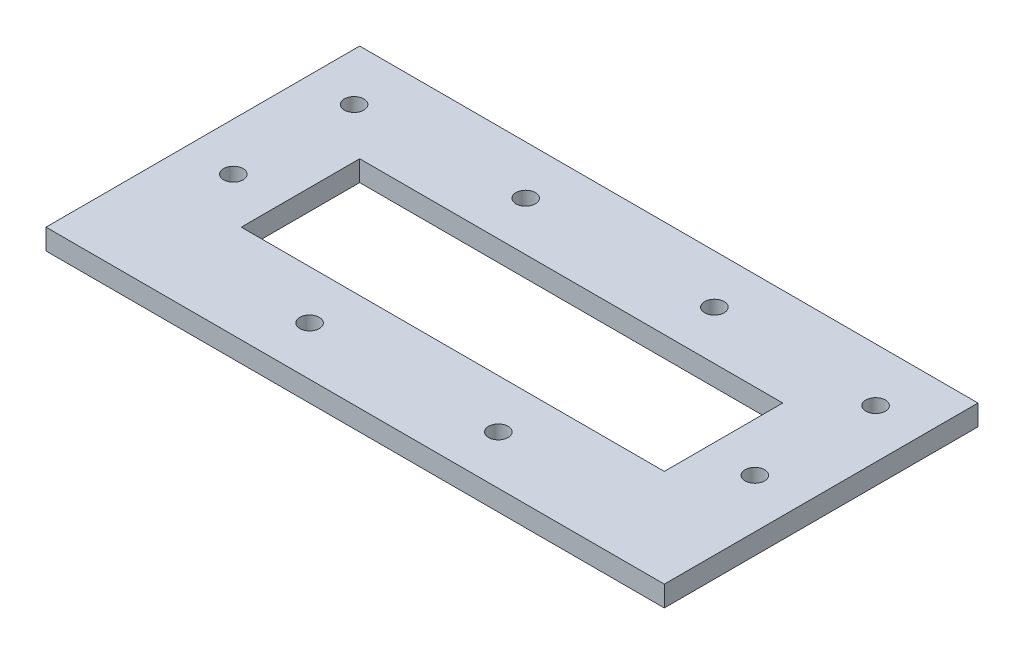
ISO-10303-21;
HEADER;
FILE_DESCRIPTION(('STEP AP214'),'2;1');
FILE_NAME('part.step','',(''),(''),'','','');
FILE_SCHEMA(('AUTOMOTIVE_DESIGN { 1 0 10303 214 1 1 1 1 }'));
ENDSEC;
DATA;
#1=APPLICATION_CONTEXT('core data for automotive mechanical design processes');
#2=APPLICATION_PROTOCOL_DEFINITION('international standard','automotive_design',2000,#1);
#3=PRODUCT_CONTEXT('',#1,'mechanical');
#4=PRODUCT('Part','Part','',(#3));
#5=PRODUCT_RELATED_PRODUCT_CATEGORY('part','',(#4));
#6=PRODUCT_DEFINITION_FORMATION('','',#4);
#7=PRODUCT_DEFINITION_CONTEXT('part definition',#1,'design');
#8=PRODUCT_DEFINITION('design','',#6,#7);
#9=PRODUCT_DEFINITION_SHAPE('','',#8);
#10=(LENGTH_UNIT() NAMED_UNIT(*) SI_UNIT(.MILLI.,.METRE.));
#11=(NAMED_UNIT(*) PLANE_ANGLE_UNIT() SI_UNIT($,.RADIAN.));
#12=(NAMED_UNIT(*) SI_UNIT($,.STERADIAN.) SOLID_ANGLE_UNIT());
#13=UNCERTAINTY_MEASURE_WITH_UNIT(LENGTH_MEASURE(1.E-05),#10,'distance_accuracy_value','');
#14=(GEOMETRIC_REPRESENTATION_CONTEXT(3) GLOBAL_UNCERTAINTY_ASSIGNED_CONTEXT((#13)) GLOBAL_UNIT_ASSIGNED_CONTEXT((#10,
#11,#12)) REPRESENTATION_CONTEXT('',''));
#15=CARTESIAN_POINT('',(0.,0.,0.));
#16=DIRECTION('',(0.,0.,1.));
#17=DIRECTION('',(1.,0.,0.));
#18=AXIS2_PLACEMENT_3D('',#15,#16,#17);
#19=CARTESIAN_POINT('',(0.,3.175,0.));
#20=DIRECTION('',(0.,-1.,0.));
#21=DIRECTION('',(0.,0.,-1.));
#22=AXIS2_PLACEMENT_3D('',#19,#20,#21);
#23=PLANE('',#22);
#24=DIRECTION('',(0.,0.,-1.));
#25=VECTOR('',#24,1.);
#26=CARTESIAN_POINT('',(47.499999996,3.175,24.098680149));
#27=LINE('',#26,#25);
#28=CARTESIAN_POINT('',(47.499999996,3.175,24.098680149));
#29=VERTEX_POINT('',#28);
#30=CARTESIAN_POINT('',(47.499999996,3.175,-24.098680149));
#31=VERTEX_POINT('',#30);
#32=EDGE_CURVE('E139',#29,#31,#27,.T.);
#33=ORIENTED_EDGE('',*,*,#32,.T.);
#34=DIRECTION('',(-1.,0.,0.));
#35=VECTOR('',#34,1.);
#36=CARTESIAN_POINT('',(-47.499999996,3.175,-24.098680149));
#37=LINE('',#36,#35);
#38=CARTESIAN_POINT('',(-47.499999996,3.175,-24.098680149));
#39=VERTEX_POINT('',#38);
#40=EDGE_CURVE('E142',#31,#39,#37,.T.);
#41=ORIENTED_EDGE('',*,*,#40,.T.);
#42=DIRECTION('',(0.,0.,1.));
#43=VECTOR('',#42,1.);
#44=CARTESIAN_POINT('',(-47.499999996,3.175,24.098680149));
#45=LINE('',#44,#43);
#46=CARTESIAN_POINT('',(-47.499999996,3.175,24.098680149));
#47=VERTEX_POINT('',#46);
#48=EDGE_CURVE('E145',#39,#47,#45,.T.);
#49=ORIENTED_EDGE('',*,*,#48,.T.);
#50=DIRECTION('',(1.,0.,0.));
#51=VECTOR('',#50,1.);
#52=CARTESIAN_POINT('',(-47.499999996,3.175,24.098680149));
#53=LINE('',#52,#51);
#54=EDGE_CURVE('E147',#47,#29,#53,.T.);
#55=ORIENTED_EDGE('',*,*,#54,.T.);
#56=EDGE_LOOP('',(#33,#41,#49,#55));
#57=FACE_BOUND('',#56,.T.);
#58=DIRECTION('',(0.,0.,-1.));
#59=VECTOR('',#58,1.);
#60=CARTESIAN_POINT('',(32.499999996,3.175,9.09868014899999));
#61=LINE('',#60,#59);
#62=CARTESIAN_POINT('',(32.499999996,3.175,9.09868014899999));
#63=VERTEX_POINT('',#62);
#64=CARTESIAN_POINT('',(32.499999996,3.175,-9.09868014900001));
#65=VERTEX_POINT('',#64);
#66=EDGE_CURVE('E100',#63,#65,#61,.T.);
#67=ORIENTED_EDGE('',*,*,#66,.F.);
#68=DIRECTION('',(1.,0.,0.));
#69=VECTOR('',#68,1.);
#70=CARTESIAN_POINT('',(-32.499999996,3.175,9.098680149));
#71=LINE('',#70,#69);
#72=CARTESIAN_POINT('',(-32.499999996,3.175,9.098680149));
#73=VERTEX_POINT('',#72);
#74=EDGE_CURVE('E123',#73,#63,#71,.T.);
#75=ORIENTED_EDGE('',*,*,#74,.F.);
#76=DIRECTION('',(0.,0.,1.));
#77=VECTOR('',#76,1.);
#78=CARTESIAN_POINT('',(-32.499999996,3.175,9.098680149));
#79=LINE('',#78,#77);
#80=CARTESIAN_POINT('',(-32.499999996,3.175,-9.09868014900001));
#81=VERTEX_POINT('',#80);
#82=EDGE_CURVE('E121',#81,#73,#79,.T.);
#83=ORIENTED_EDGE('',*,*,#82,.F.);
#84=DIRECTION('',(-1.,0.,0.));
#85=VECTOR('',#84,1.);
#86=CARTESIAN_POINT('',(-32.499999996,3.175,-9.09868014900001));
#87=LINE('',#86,#85);
#88=EDGE_CURVE('E108',#65,#81,#87,.T.);
#89=ORIENTED_EDGE('',*,*,#88,.F.);
#90=EDGE_LOOP('',(#67,#75,#83,#89));
#91=FACE_BOUND('',#90,.T.);
#92=CARTESIAN_POINT('',(-14.499999996,3.175,-16.598680149));
#93=DIRECTION('',(0.,1.,0.));
#94=DIRECTION('',(0.,0.,1.));
#95=AXIS2_PLACEMENT_3D('',#92,#93,#94);
#96=CIRCLE('',#95,1.5);
#97=CARTESIAN_POINT('',(-14.499999996,3.175,-15.098680149));
#98=VERTEX_POINT('',#97);
#99=EDGE_CURVE('E129',#98,#98,#96,.T.);
#100=ORIENTED_EDGE('',*,*,#99,.F.);
#101=EDGE_LOOP('',(#100));
#102=FACE_BOUND('',#101,.T.);
#103=CARTESIAN_POINT('',(14.499999996,3.175,-16.598680149));
#104=DIRECTION('',(0.,1.,0.));
#105=DIRECTION('',(0.,0.,1.));
#106=AXIS2_PLACEMENT_3D('',#103,#104,#105);
#107=CIRCLE('',#106,1.5);
#108=CARTESIAN_POINT('',(14.499999996,3.175,-15.098680149));
#109=VERTEX_POINT('',#108);
#110=EDGE_CURVE('E291',#109,#109,#107,.T.);
#111=ORIENTED_EDGE('',*,*,#110,.F.);
#112=EDGE_LOOP('',(#111));
#113=FACE_BOUND('',#112,.T.);
#114=CARTESIAN_POINT('',(-40.1489742278698,3.175,-15.8817618874375));
#115=DIRECTION('',(0.,1.,0.));
#116=DIRECTION('',(0.,0.,1.));
#117=AXIS2_PLACEMENT_3D('',#114,#115,#116);
#118=CIRCLE('',#117,1.5);
#119=CARTESIAN_POINT('',(-40.1489742278698,3.175,-14.3817618874374));
#120=VERTEX_POINT('',#119);
#121=EDGE_CURVE('E285',#120,#120,#118,.T.);
#122=ORIENTED_EDGE('',*,*,#121,.F.);
#123=EDGE_LOOP('',(#122));
#124=FACE_BOUND('',#123,.T.);
#125=CARTESIAN_POINT('',(-40.1489742278698,3.175,2.662696696534));
#126=DIRECTION('',(0.,1.,0.));
#127=DIRECTION('',(0.,0.,1.));
#128=AXIS2_PLACEMENT_3D('',#125,#126,#127);
#129=CIRCLE('',#128,1.5);
#130=CARTESIAN_POINT('',(-40.1489742278698,3.175,4.162696696534));
#131=VERTEX_POINT('',#130);
#132=EDGE_CURVE('E279',#131,#131,#129,.T.);
#133=ORIENTED_EDGE('',*,*,#132,.F.);
#134=EDGE_LOOP('',(#133));
#135=FACE_BOUND('',#134,.T.);
#136=CARTESIAN_POINT('',(39.9788527335526,3.175,-15.8817618874375));
#137=DIRECTION('',(0.,1.,0.));
#138=DIRECTION('',(0.,0.,1.));
#139=AXIS2_PLACEMENT_3D('',#136,#137,#138);
#140=CIRCLE('',#139,1.5);
#141=CARTESIAN_POINT('',(39.9788527335526,3.175,-14.3817618874374));
#142=VERTEX_POINT('',#141);
#143=EDGE_CURVE('E273',#142,#142,#140,.T.);
#144=ORIENTED_EDGE('',*,*,#143,.F.);
#145=EDGE_LOOP('',(#144));
#146=FACE_BOUND('',#145,.T.);
#147=CARTESIAN_POINT('',(39.9788527335526,3.175,2.662696696534));
#148=DIRECTION('',(0.,1.,0.));
#149=DIRECTION('',(0.,0.,1.));
#150=AXIS2_PLACEMENT_3D('',#147,#148,#149);
#151=CIRCLE('',#150,1.5);
#152=CARTESIAN_POINT('',(39.9788527335526,3.175,4.16269669653401));
#153=VERTEX_POINT('',#152);
#154=EDGE_CURVE('E267',#153,#153,#151,.T.);
#155=ORIENTED_EDGE('',*,*,#154,.F.);
#156=EDGE_LOOP('',(#155));
#157=FACE_BOUND('',#156,.T.);
#158=CARTESIAN_POINT('',(-14.499999996,3.175,16.598680149));
#159=DIRECTION('',(0.,1.,0.));
#160=DIRECTION('',(0.,0.,1.));
#161=AXIS2_PLACEMENT_3D('',#158,#159,#160);
#162=CIRCLE('',#161,1.5);
#163=CARTESIAN_POINT('',(-14.499999996,3.175,18.098680149));
#164=VERTEX_POINT('',#163);
#165=EDGE_CURVE('E261',#164,#164,#162,.T.);
#166=ORIENTED_EDGE('',*,*,#165,.F.);
#167=EDGE_LOOP('',(#166));
#168=FACE_BOUND('',#167,.T.);
#169=CARTESIAN_POINT('',(14.499999996,3.175,16.598680149));
#170=DIRECTION('',(0.,1.,0.));
#171=DIRECTION('',(0.,0.,1.));
#172=AXIS2_PLACEMENT_3D('',#169,#170,#171);
#173=CIRCLE('',#172,1.5);
#174=CARTESIAN_POINT('',(14.499999996,3.175,18.098680149));
#175=VERTEX_POINT('',#174);
#176=EDGE_CURVE('E252',#175,#175,#173,.T.);
#177=ORIENTED_EDGE('',*,*,#176,.F.);
#178=EDGE_LOOP('',(#177));
#179=FACE_BOUND('',#178,.T.);
#180=ADVANCED_FACE('F35',(#57,#91,#102,#113,#124,#135,#146,#157,#168,#179),#23,.F.);
#181=CARTESIAN_POINT('',(0.,0.,0.));
#182=DIRECTION('',(0.,-1.,0.));
#183=DIRECTION('',(0.,0.,-1.));
#184=AXIS2_PLACEMENT_3D('',#181,#182,#183);
#185=PLANE('',#184);
#186=CARTESIAN_POINT('',(-14.499999996,0.,16.598680149));
#187=DIRECTION('',(0.,1.,0.));
#188=DIRECTION('',(0.,0.,1.));
#189=AXIS2_PLACEMENT_3D('',#186,#187,#188);
#190=CIRCLE('',#189,1.5);
#191=CARTESIAN_POINT('',(-14.499999996,0.,18.098680149));
#192=VERTEX_POINT('',#191);
#193=EDGE_CURVE('E258',#192,#192,#190,.T.);
#194=ORIENTED_EDGE('',*,*,#193,.T.);
#195=EDGE_LOOP('',(#194));
#196=FACE_BOUND('',#195,.T.);
#197=CARTESIAN_POINT('',(39.9788527335526,0.,-15.8817618874375));
#198=DIRECTION('',(0.,1.,0.));
#199=DIRECTION('',(0.,0.,1.));
#200=AXIS2_PLACEMENT_3D('',#197,#198,#199);
#201=CIRCLE('',#200,1.5);
#202=CARTESIAN_POINT('',(39.9788527335526,0.,-14.3817618874374));
#203=VERTEX_POINT('',#202);
#204=EDGE_CURVE('E270',#203,#203,#201,.T.);
#205=ORIENTED_EDGE('',*,*,#204,.T.);
#206=EDGE_LOOP('',(#205));
#207=FACE_BOUND('',#206,.T.);
#208=CARTESIAN_POINT('',(-40.1489742278698,0.,-15.8817618874375));
#209=DIRECTION('',(0.,1.,0.));
#210=DIRECTION('',(0.,0.,1.));
#211=AXIS2_PLACEMENT_3D('',#208,#209,#210);
#212=CIRCLE('',#211,1.5);
#213=CARTESIAN_POINT('',(-40.1489742278698,0.,-14.3817618874374));
#214=VERTEX_POINT('',#213);
#215=EDGE_CURVE('E282',#214,#214,#212,.T.);
#216=ORIENTED_EDGE('',*,*,#215,.T.);
#217=EDGE_LOOP('',(#216));
#218=FACE_BOUND('',#217,.T.);
#219=CARTESIAN_POINT('',(-14.499999996,0.,-16.598680149));
#220=DIRECTION('',(0.,1.,0.));
#221=DIRECTION('',(0.,0.,1.));
#222=AXIS2_PLACEMENT_3D('',#219,#220,#221);
#223=CIRCLE('',#222,1.5);
#224=CARTESIAN_POINT('',(-14.499999996,0.,-15.098680149));
#225=VERTEX_POINT('',#224);
#226=EDGE_CURVE('E294',#225,#225,#223,.T.);
#227=ORIENTED_EDGE('',*,*,#226,.T.);
#228=EDGE_LOOP('',(#227));
#229=FACE_BOUND('',#228,.T.);
#230=DIRECTION('',(0.,0.,-1.));
#231=VECTOR('',#230,1.);
#232=CARTESIAN_POINT('',(47.499999996,0.,24.098680149));
#233=LINE('',#232,#231);
#234=CARTESIAN_POINT('',(47.499999996,0.,24.098680149));
#235=VERTEX_POINT('',#234);
#236=CARTESIAN_POINT('',(47.499999996,0.,-24.098680149));
#237=VERTEX_POINT('',#236);
#238=EDGE_CURVE('E116',#235,#237,#233,.T.);
#239=ORIENTED_EDGE('',*,*,#238,.F.);
#240=DIRECTION('',(1.,0.,0.));
#241=VECTOR('',#240,1.);
#242=CARTESIAN_POINT('',(-47.499999996,0.,24.098680149));
#243=LINE('',#242,#241);
#244=CARTESIAN_POINT('',(-47.499999996,0.,24.098680149));
#245=VERTEX_POINT('',#244);
#246=EDGE_CURVE('E143',#245,#235,#243,.T.);
#247=ORIENTED_EDGE('',*,*,#246,.F.);
#248=DIRECTION('',(0.,0.,1.));
#249=VECTOR('',#248,1.);
#250=CARTESIAN_POINT('',(-47.499999996,0.,24.098680149));
#251=LINE('',#250,#249);
#252=CARTESIAN_POINT('',(-47.499999996,0.,-24.098680149));
#253=VERTEX_POINT('',#252);
#254=EDGE_CURVE('E154',#253,#245,#251,.T.);
#255=ORIENTED_EDGE('',*,*,#254,.F.);
#256=DIRECTION('',(-1.,0.,0.));
#257=VECTOR('',#256,1.);
#258=CARTESIAN_POINT('',(-47.499999996,0.,-24.098680149));
#259=LINE('',#258,#257);
#260=EDGE_CURVE('E152',#237,#253,#259,.T.);
#261=ORIENTED_EDGE('',*,*,#260,.F.);
#262=EDGE_LOOP('',(#239,#247,#255,#261));
#263=FACE_BOUND('',#262,.T.);
#264=DIRECTION('',(1.,0.,0.));
#265=VECTOR('',#264,1.);
#266=CARTESIAN_POINT('',(-32.499999996,0.,9.098680149));
#267=LINE('',#266,#265);
#268=CARTESIAN_POINT('',(-32.499999996,0.,9.098680149));
#269=VERTEX_POINT('',#268);
#270=CARTESIAN_POINT('',(32.499999996,0.,9.09868014899999));
#271=VERTEX_POINT('',#270);
#272=EDGE_CURVE('E109',#269,#271,#267,.T.);
#273=ORIENTED_EDGE('',*,*,#272,.T.);
#274=DIRECTION('',(0.,0.,-1.));
#275=VECTOR('',#274,1.);
#276=CARTESIAN_POINT('',(32.499999996,0.,9.09868014899999));
#277=LINE('',#276,#275);
#278=CARTESIAN_POINT('',(32.499999996,0.,-9.09868014900001));
#279=VERTEX_POINT('',#278);
#280=EDGE_CURVE('E58',#271,#279,#277,.T.);
#281=ORIENTED_EDGE('',*,*,#280,.T.);
#282=DIRECTION('',(-1.,0.,0.));
#283=VECTOR('',#282,1.);
#284=CARTESIAN_POINT('',(-32.499999996,0.,-9.09868014900001));
#285=LINE('',#284,#283);
#286=CARTESIAN_POINT('',(-32.499999996,0.,-9.09868014900001));
#287=VERTEX_POINT('',#286);
#288=EDGE_CURVE('E115',#279,#287,#285,.T.);
#289=ORIENTED_EDGE('',*,*,#288,.T.);
#290=DIRECTION('',(0.,0.,1.));
#291=VECTOR('',#290,1.);
#292=CARTESIAN_POINT('',(-32.499999996,0.,9.098680149));
#293=LINE('',#292,#291);
#294=EDGE_CURVE('E131',#287,#269,#293,.T.);
#295=ORIENTED_EDGE('',*,*,#294,.T.);
#296=EDGE_LOOP('',(#273,#281,#289,#295));
#297=FACE_BOUND('',#296,.T.);
#298=CARTESIAN_POINT('',(14.499999996,0.,-16.598680149));
#299=DIRECTION('',(0.,1.,0.));
#300=DIRECTION('',(0.,0.,1.));
#301=AXIS2_PLACEMENT_3D('',#298,#299,#300);
#302=CIRCLE('',#301,1.5);
#303=CARTESIAN_POINT('',(14.499999996,0.,-15.098680149));
#304=VERTEX_POINT('',#303);
#305=EDGE_CURVE('E288',#304,#304,#302,.T.);
#306=ORIENTED_EDGE('',*,*,#305,.T.);
#307=EDGE_LOOP('',(#306));
#308=FACE_BOUND('',#307,.T.);
#309=CARTESIAN_POINT('',(-40.1489742278698,0.,2.662696696534));
#310=DIRECTION('',(0.,1.,0.));
#311=DIRECTION('',(0.,0.,1.));
#312=AXIS2_PLACEMENT_3D('',#309,#310,#311);
#313=CIRCLE('',#312,1.5);
#314=CARTESIAN_POINT('',(-40.1489742278698,0.,4.162696696534));
#315=VERTEX_POINT('',#314);
#316=EDGE_CURVE('E276',#315,#315,#313,.T.);
#317=ORIENTED_EDGE('',*,*,#316,.T.);
#318=EDGE_LOOP('',(#317));
#319=FACE_BOUND('',#318,.T.);
#320=CARTESIAN_POINT('',(39.9788527335526,0.,2.662696696534));
#321=DIRECTION('',(0.,1.,0.));
#322=DIRECTION('',(0.,0.,1.));
#323=AXIS2_PLACEMENT_3D('',#320,#321,#322);
#324=CIRCLE('',#323,1.5);
#325=CARTESIAN_POINT('',(39.9788527335526,0.,4.16269669653401));
#326=VERTEX_POINT('',#325);
#327=EDGE_CURVE('E264',#326,#326,#324,.T.);
#328=ORIENTED_EDGE('',*,*,#327,.T.);
#329=EDGE_LOOP('',(#328));
#330=FACE_BOUND('',#329,.T.);
#331=CARTESIAN_POINT('',(14.499999996,0.,16.598680149));
#332=DIRECTION('',(0.,1.,0.));
#333=DIRECTION('',(0.,0.,1.));
#334=AXIS2_PLACEMENT_3D('',#331,#332,#333);
#335=CIRCLE('',#334,1.5);
#336=CARTESIAN_POINT('',(14.499999996,0.,18.098680149));
#337=VERTEX_POINT('',#336);
#338=EDGE_CURVE('E255',#337,#337,#335,.T.);
#339=ORIENTED_EDGE('',*,*,#338,.T.);
#340=EDGE_LOOP('',(#339));
#341=FACE_BOUND('',#340,.T.);
#342=ADVANCED_FACE('F172',(#196,#207,#218,#229,#263,#297,#308,#319,#330,#341),#185,.T.);
#343=CARTESIAN_POINT('',(47.499999996,3.175,24.098680149));
#344=DIRECTION('',(-1.,0.,0.));
#345=DIRECTION('',(0.,0.,1.));
#346=AXIS2_PLACEMENT_3D('',#343,#344,#345);
#347=PLANE('',#346);
#348=ORIENTED_EDGE('',*,*,#238,.T.);
#349=DIRECTION('',(0.,-1.,0.));
#350=VECTOR('',#349,1.);
#351=CARTESIAN_POINT('',(47.499999996,3.175,-24.098680149));
#352=LINE('',#351,#350);
#353=EDGE_CURVE('E11',#31,#237,#352,.T.);
#354=ORIENTED_EDGE('',*,*,#353,.F.);
#355=ORIENTED_EDGE('',*,*,#32,.F.);
#356=DIRECTION('',(0.,-1.,0.));
#357=VECTOR('',#356,1.);
#358=CARTESIAN_POINT('',(47.499999996,3.175,24.098680149));
#359=LINE('',#358,#357);
#360=EDGE_CURVE('E149',#29,#235,#359,.T.);
#361=ORIENTED_EDGE('',*,*,#360,.T.);
#362=EDGE_LOOP('',(#348,#354,#355,#361));
#363=FACE_BOUND('',#362,.T.);
#364=ADVANCED_FACE('F37',(#363),#347,.F.);
#365=CARTESIAN_POINT('',(-47.499999996,3.175,-24.098680149));
#366=DIRECTION('',(0.,0.,1.));
#367=DIRECTION('',(1.,0.,0.));
#368=AXIS2_PLACEMENT_3D('',#365,#366,#367);
#369=PLANE('',#368);
#370=ORIENTED_EDGE('',*,*,#260,.T.);
#371=DIRECTION('',(0.,-1.,0.));
#372=VECTOR('',#371,1.);
#373=CARTESIAN_POINT('',(-47.499999996,3.175,-24.098680149));
#374=LINE('',#373,#372);
#375=EDGE_CURVE('E43',#39,#253,#374,.T.);
#376=ORIENTED_EDGE('',*,*,#375,.F.);
#377=ORIENTED_EDGE('',*,*,#40,.F.);
#378=ORIENTED_EDGE('',*,*,#353,.T.);
#379=EDGE_LOOP('',(#370,#376,#377,#378));
#380=FACE_BOUND('',#379,.T.);
#381=ADVANCED_FACE('F182',(#380),#369,.F.);
#382=CARTESIAN_POINT('',(-47.499999996,3.175,24.098680149));
#383=DIRECTION('',(1.,0.,0.));
#384=DIRECTION('',(0.,0.,-1.));
#385=AXIS2_PLACEMENT_3D('',#382,#383,#384);
#386=PLANE('',#385);
#387=ORIENTED_EDGE('',*,*,#254,.T.);
#388=DIRECTION('',(0.,-1.,0.));
#389=VECTOR('',#388,1.);
#390=CARTESIAN_POINT('',(-47.499999996,3.175,24.098680149));
#391=LINE('',#390,#389);
#392=EDGE_CURVE('E159',#47,#245,#391,.T.);
#393=ORIENTED_EDGE('',*,*,#392,.F.);
#394=ORIENTED_EDGE('',*,*,#48,.F.);
#395=ORIENTED_EDGE('',*,*,#375,.T.);
#396=EDGE_LOOP('',(#387,#393,#394,#395));
#397=FACE_BOUND('',#396,.T.);
#398=ADVANCED_FACE('F166',(#397),#386,.F.);
#399=CARTESIAN_POINT('',(-47.499999996,3.175,24.098680149));
#400=DIRECTION('',(0.,0.,-1.));
#401=DIRECTION('',(-1.,0.,0.));
#402=AXIS2_PLACEMENT_3D('',#399,#400,#401);
#403=PLANE('',#402);
#404=ORIENTED_EDGE('',*,*,#246,.T.);
#405=ORIENTED_EDGE('',*,*,#360,.F.);
#406=ORIENTED_EDGE('',*,*,#54,.F.);
#407=ORIENTED_EDGE('',*,*,#392,.T.);
#408=EDGE_LOOP('',(#404,#405,#406,#407));
#409=FACE_BOUND('',#408,.T.);
#410=ADVANCED_FACE('F176',(#409),#403,.F.);
#411=CARTESIAN_POINT('',(32.499999996,3.175,9.09868014899999));
#412=DIRECTION('',(-1.,0.,0.));
#413=DIRECTION('',(0.,0.,1.));
#414=AXIS2_PLACEMENT_3D('',#411,#412,#413);
#415=PLANE('',#414);
#416=ORIENTED_EDGE('',*,*,#280,.F.);
#417=DIRECTION('',(0.,-1.,0.));
#418=VECTOR('',#417,1.);
#419=CARTESIAN_POINT('',(32.499999996,3.175,9.09868014899999));
#420=LINE('',#419,#418);
#421=EDGE_CURVE('E104',#63,#271,#420,.T.);
#422=ORIENTED_EDGE('',*,*,#421,.F.);
#423=ORIENTED_EDGE('',*,*,#66,.T.);
#424=DIRECTION('',(0.,-1.,0.));
#425=VECTOR('',#424,1.);
#426=CARTESIAN_POINT('',(32.499999996,3.175,-9.09868014900001));
#427=LINE('',#426,#425);
#428=EDGE_CURVE('E103',#65,#279,#427,.T.);
#429=ORIENTED_EDGE('',*,*,#428,.T.);
#430=EDGE_LOOP('',(#416,#422,#423,#429));
#431=FACE_BOUND('',#430,.T.);
#432=ADVANCED_FACE('F102',(#431),#415,.T.);
#433=CARTESIAN_POINT('',(-32.499999996,3.175,-9.09868014900001));
#434=DIRECTION('',(0.,0.,1.));
#435=DIRECTION('',(1.,0.,0.));
#436=AXIS2_PLACEMENT_3D('',#433,#434,#435);
#437=PLANE('',#436);
#438=ORIENTED_EDGE('',*,*,#288,.F.);
#439=ORIENTED_EDGE('',*,*,#428,.F.);
#440=ORIENTED_EDGE('',*,*,#88,.T.);
#441=DIRECTION('',(0.,-1.,0.));
#442=VECTOR('',#441,1.);
#443=CARTESIAN_POINT('',(-32.499999996,3.175,-9.09868014900001));
#444=LINE('',#443,#442);
#445=EDGE_CURVE('E117',#81,#287,#444,.T.);
#446=ORIENTED_EDGE('',*,*,#445,.T.);
#447=EDGE_LOOP('',(#438,#439,#440,#446));
#448=FACE_BOUND('',#447,.T.);
#449=ADVANCED_FACE('F112',(#448),#437,.T.);
#450=CARTESIAN_POINT('',(-32.499999996,3.175,9.098680149));
#451=DIRECTION('',(1.,0.,0.));
#452=DIRECTION('',(0.,0.,-1.));
#453=AXIS2_PLACEMENT_3D('',#450,#451,#452);
#454=PLANE('',#453);
#455=ORIENTED_EDGE('',*,*,#294,.F.);
#456=ORIENTED_EDGE('',*,*,#445,.F.);
#457=ORIENTED_EDGE('',*,*,#82,.T.);
#458=DIRECTION('',(0.,-1.,0.));
#459=VECTOR('',#458,1.);
#460=CARTESIAN_POINT('',(-32.499999996,3.175,9.098680149));
#461=LINE('',#460,#459);
#462=EDGE_CURVE('E50',#73,#269,#461,.T.);
#463=ORIENTED_EDGE('',*,*,#462,.T.);
#464=EDGE_LOOP('',(#455,#456,#457,#463));
#465=FACE_BOUND('',#464,.T.);
#466=ADVANCED_FACE('F206',(#465),#454,.T.);
#467=CARTESIAN_POINT('',(-32.499999996,3.175,9.098680149));
#468=DIRECTION('',(0.,0.,-1.));
#469=DIRECTION('',(-1.,0.,0.));
#470=AXIS2_PLACEMENT_3D('',#467,#468,#469);
#471=PLANE('',#470);
#472=ORIENTED_EDGE('',*,*,#272,.F.);
#473=ORIENTED_EDGE('',*,*,#462,.F.);
#474=ORIENTED_EDGE('',*,*,#74,.T.);
#475=ORIENTED_EDGE('',*,*,#421,.T.);
#476=EDGE_LOOP('',(#472,#473,#474,#475));
#477=FACE_BOUND('',#476,.T.);
#478=ADVANCED_FACE('F210',(#477),#471,.T.);
#479=CARTESIAN_POINT('',(-14.499999996,3.175,-16.598680149));
#480=DIRECTION('',(0.,-1.,0.));
#481=DIRECTION('',(0.,0.,-1.));
#482=AXIS2_PLACEMENT_3D('',#479,#480,#481);
#483=CYLINDRICAL_SURFACE('',#482,1.5);
#484=ORIENTED_EDGE('',*,*,#99,.T.);
#485=EDGE_LOOP('',(#484));
#486=FACE_BOUND('',#485,.T.);
#487=ORIENTED_EDGE('',*,*,#226,.F.);
#488=EDGE_LOOP('',(#487));
#489=FACE_BOUND('',#488,.T.);
#490=ADVANCED_FACE('F216',(#486,#489),#483,.F.);
#491=CARTESIAN_POINT('',(14.499999996,3.175,-16.598680149));
#492=DIRECTION('',(0.,-1.,0.));
#493=DIRECTION('',(0.,0.,-1.));
#494=AXIS2_PLACEMENT_3D('',#491,#492,#493);
#495=CYLINDRICAL_SURFACE('',#494,1.5);
#496=ORIENTED_EDGE('',*,*,#110,.T.);
#497=EDGE_LOOP('',(#496));
#498=FACE_BOUND('',#497,.T.);
#499=ORIENTED_EDGE('',*,*,#305,.F.);
#500=EDGE_LOOP('',(#499));
#501=FACE_BOUND('',#500,.T.);
#502=ADVANCED_FACE('F219',(#498,#501),#495,.F.);
#503=CARTESIAN_POINT('',(-40.1489742278698,3.175,-15.8817618874375));
#504=DIRECTION('',(0.,-1.,0.));
#505=DIRECTION('',(0.,0.,-1.));
#506=AXIS2_PLACEMENT_3D('',#503,#504,#505);
#507=CYLINDRICAL_SURFACE('',#506,1.5);
#508=ORIENTED_EDGE('',*,*,#121,.T.);
#509=EDGE_LOOP('',(#508));
#510=FACE_BOUND('',#509,.T.);
#511=ORIENTED_EDGE('',*,*,#215,.F.);
#512=EDGE_LOOP('',(#511));
#513=FACE_BOUND('',#512,.T.);
#514=ADVANCED_FACE('F223',(#510,#513),#507,.F.);
#515=CARTESIAN_POINT('',(-40.1489742278698,3.175,2.662696696534));
#516=DIRECTION('',(0.,-1.,0.));
#517=DIRECTION('',(0.,0.,-1.));
#518=AXIS2_PLACEMENT_3D('',#515,#516,#517);
#519=CYLINDRICAL_SURFACE('',#518,1.5);
#520=ORIENTED_EDGE('',*,*,#132,.T.);
#521=EDGE_LOOP('',(#520));
#522=FACE_BOUND('',#521,.T.);
#523=ORIENTED_EDGE('',*,*,#316,.F.);
#524=EDGE_LOOP('',(#523));
#525=FACE_BOUND('',#524,.T.);
#526=ADVANCED_FACE('F227',(#522,#525),#519,.F.);
#527=CARTESIAN_POINT('',(39.9788527335526,3.175,-15.8817618874375));
#528=DIRECTION('',(0.,-1.,0.));
#529=DIRECTION('',(0.,0.,-1.));
#530=AXIS2_PLACEMENT_3D('',#527,#528,#529);
#531=CYLINDRICAL_SURFACE('',#530,1.5);
#532=ORIENTED_EDGE('',*,*,#143,.T.);
#533=EDGE_LOOP('',(#532));
#534=FACE_BOUND('',#533,.T.);
#535=ORIENTED_EDGE('',*,*,#204,.F.);
#536=EDGE_LOOP('',(#535));
#537=FACE_BOUND('',#536,.T.);
#538=ADVANCED_FACE('F231',(#534,#537),#531,.F.);
#539=CARTESIAN_POINT('',(39.9788527335526,3.175,2.662696696534));
#540=DIRECTION('',(0.,-1.,0.));
#541=DIRECTION('',(0.,0.,-1.));
#542=AXIS2_PLACEMENT_3D('',#539,#540,#541);
#543=CYLINDRICAL_SURFACE('',#542,1.5);
#544=ORIENTED_EDGE('',*,*,#154,.T.);
#545=EDGE_LOOP('',(#544));
#546=FACE_BOUND('',#545,.T.);
#547=ORIENTED_EDGE('',*,*,#327,.F.);
#548=EDGE_LOOP('',(#547));
#549=FACE_BOUND('',#548,.T.);
#550=ADVANCED_FACE('F235',(#546,#549),#543,.F.);
#551=CARTESIAN_POINT('',(-14.499999996,3.175,16.598680149));
#552=DIRECTION('',(0.,-1.,0.));
#553=DIRECTION('',(0.,0.,-1.));
#554=AXIS2_PLACEMENT_3D('',#551,#552,#553);
#555=CYLINDRICAL_SURFACE('',#554,1.5);
#556=ORIENTED_EDGE('',*,*,#165,.T.);
#557=EDGE_LOOP('',(#556));
#558=FACE_BOUND('',#557,.T.);
#559=ORIENTED_EDGE('',*,*,#193,.F.);
#560=EDGE_LOOP('',(#559));
#561=FACE_BOUND('',#560,.T.);
#562=ADVANCED_FACE('F239',(#558,#561),#555,.F.);
#563=CARTESIAN_POINT('',(14.499999996,3.175,16.598680149));
#564=DIRECTION('',(0.,-1.,0.));
#565=DIRECTION('',(0.,0.,-1.));
#566=AXIS2_PLACEMENT_3D('',#563,#564,#565);
#567=CYLINDRICAL_SURFACE('',#566,1.5);
#568=ORIENTED_EDGE('',*,*,#176,.T.);
#569=EDGE_LOOP('',(#568));
#570=FACE_BOUND('',#569,.T.);
#571=ORIENTED_EDGE('',*,*,#338,.F.);
#572=EDGE_LOOP('',(#571));
#573=FACE_BOUND('',#572,.T.);
#574=ADVANCED_FACE('F243',(#570,#573),#567,.F.);
#575=CLOSED_SHELL('',(#180,#342,#364,#381,#398,#410,#432,#449,#466,#478,#490,#502,#514,#526,
#538,#550,#562,#574));
#576=MANIFOLD_SOLID_BREP('B2',#575);
#577=ADVANCED_BREP_SHAPE_REPRESENTATION('',(#18,#576),#14);
#578=SHAPE_DEFINITION_REPRESENTATION(#9,#577);
ENDSEC;
END-ISO-10303-21;
